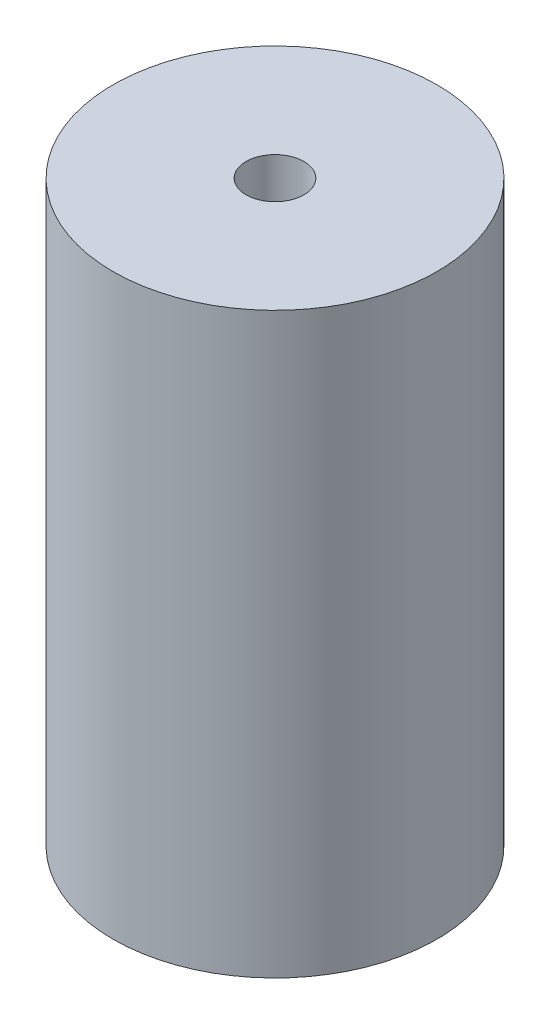
ISO-10303-21;
HEADER;
FILE_DESCRIPTION(('STEP AP214'),'2;1');
FILE_NAME('part.step','',(''),(''),'','','');
FILE_SCHEMA(('AUTOMOTIVE_DESIGN { 1 0 10303 214 1 1 1 1 }'));
ENDSEC;
DATA;
#1=APPLICATION_CONTEXT('core data for automotive mechanical design processes');
#2=APPLICATION_PROTOCOL_DEFINITION('international standard','automotive_design',2000,#1);
#3=PRODUCT_CONTEXT('',#1,'mechanical');
#4=PRODUCT('Part','Part','',(#3));
#5=PRODUCT_RELATED_PRODUCT_CATEGORY('part','',(#4));
#6=PRODUCT_DEFINITION_FORMATION('','',#4);
#7=PRODUCT_DEFINITION_CONTEXT('part definition',#1,'design');
#8=PRODUCT_DEFINITION('design','',#6,#7);
#9=PRODUCT_DEFINITION_SHAPE('','',#8);
#10=(LENGTH_UNIT() NAMED_UNIT(*) SI_UNIT(.MILLI.,.METRE.));
#11=(NAMED_UNIT(*) PLANE_ANGLE_UNIT() SI_UNIT($,.RADIAN.));
#12=(NAMED_UNIT(*) SI_UNIT($,.STERADIAN.) SOLID_ANGLE_UNIT());
#13=UNCERTAINTY_MEASURE_WITH_UNIT(LENGTH_MEASURE(1.E-05),#10,'distance_accuracy_value','');
#14=(GEOMETRIC_REPRESENTATION_CONTEXT(3) GLOBAL_UNCERTAINTY_ASSIGNED_CONTEXT((#13)) GLOBAL_UNIT_ASSIGNED_CONTEXT((#10,
#11,#12)) REPRESENTATION_CONTEXT('',''));
#15=CARTESIAN_POINT('',(0.,0.,0.));
#16=DIRECTION('',(0.,0.,1.));
#17=DIRECTION('',(1.,0.,0.));
#18=AXIS2_PLACEMENT_3D('',#15,#16,#17);
#19=CARTESIAN_POINT('',(0.,50.,0.));
#20=DIRECTION('',(0.,1.,0.));
#21=DIRECTION('',(0.,0.,1.));
#22=AXIS2_PLACEMENT_3D('',#19,#20,#21);
#23=PLANE('',#22);
#24=CARTESIAN_POINT('',(0.,50.,0.));
#25=DIRECTION('',(0.,1.,0.));
#26=DIRECTION('',(0.,0.,1.));
#27=AXIS2_PLACEMENT_3D('',#24,#25,#26);
#28=CIRCLE('',#27,14.);
#29=CARTESIAN_POINT('',(0.,50.,14.));
#30=VERTEX_POINT('',#29);
#31=EDGE_CURVE('E10',#30,#30,#28,.T.);
#32=ORIENTED_EDGE('',*,*,#31,.T.);
#33=EDGE_LOOP('',(#32));
#34=FACE_BOUND('',#33,.T.);
#35=CARTESIAN_POINT('',(0.,50.,0.));
#36=DIRECTION('',(0.,1.,0.));
#37=DIRECTION('',(0.,0.,1.));
#38=AXIS2_PLACEMENT_3D('',#35,#36,#37);
#39=CIRCLE('',#38,2.5);
#40=CARTESIAN_POINT('',(0.,50.,2.5));
#41=VERTEX_POINT('',#40);
#42=EDGE_CURVE('E46',#41,#41,#39,.T.);
#43=ORIENTED_EDGE('',*,*,#42,.F.);
#44=EDGE_LOOP('',(#43));
#45=FACE_BOUND('',#44,.T.);
#46=ADVANCED_FACE('F35',(#34,#45),#23,.T.);
#47=CARTESIAN_POINT('',(0.,0.,0.));
#48=DIRECTION('',(0.,1.,0.));
#49=DIRECTION('',(0.,0.,1.));
#50=AXIS2_PLACEMENT_3D('',#47,#48,#49);
#51=PLANE('',#50);
#52=CARTESIAN_POINT('',(0.,0.,0.));
#53=DIRECTION('',(0.,1.,0.));
#54=DIRECTION('',(0.,0.,1.));
#55=AXIS2_PLACEMENT_3D('',#52,#53,#54);
#56=CIRCLE('',#55,14.);
#57=CARTESIAN_POINT('',(0.,0.,14.));
#58=VERTEX_POINT('',#57);
#59=EDGE_CURVE('E39',#58,#58,#56,.T.);
#60=ORIENTED_EDGE('',*,*,#59,.F.);
#61=EDGE_LOOP('',(#60));
#62=FACE_BOUND('',#61,.T.);
#63=CARTESIAN_POINT('',(0.,0.,0.));
#64=DIRECTION('',(0.,1.,0.));
#65=DIRECTION('',(0.,0.,1.));
#66=AXIS2_PLACEMENT_3D('',#63,#64,#65);
#67=CIRCLE('',#66,2.5);
#68=CARTESIAN_POINT('',(0.,0.,2.5));
#69=VERTEX_POINT('',#68);
#70=EDGE_CURVE('E48',#69,#69,#67,.T.);
#71=ORIENTED_EDGE('',*,*,#70,.T.);
#72=EDGE_LOOP('',(#71));
#73=FACE_BOUND('',#72,.T.);
#74=ADVANCED_FACE('F58',(#62,#73),#51,.F.);
#75=CARTESIAN_POINT('',(0.,50.,0.));
#76=DIRECTION('',(0.,-1.,0.));
#77=DIRECTION('',(0.,0.,-1.));
#78=AXIS2_PLACEMENT_3D('',#75,#76,#77);
#79=CYLINDRICAL_SURFACE('',#78,14.);
#80=ORIENTED_EDGE('',*,*,#31,.F.);
#81=EDGE_LOOP('',(#80));
#82=FACE_BOUND('',#81,.T.);
#83=ORIENTED_EDGE('',*,*,#59,.T.);
#84=EDGE_LOOP('',(#83));
#85=FACE_BOUND('',#84,.T.);
#86=ADVANCED_FACE('F37',(#82,#85),#79,.T.);
#87=CARTESIAN_POINT('',(0.,50.,0.));
#88=DIRECTION('',(0.,-1.,0.));
#89=DIRECTION('',(0.,0.,-1.));
#90=AXIS2_PLACEMENT_3D('',#87,#88,#89);
#91=CYLINDRICAL_SURFACE('',#90,2.5);
#92=ORIENTED_EDGE('',*,*,#42,.T.);
#93=EDGE_LOOP('',(#92));
#94=FACE_BOUND('',#93,.T.);
#95=ORIENTED_EDGE('',*,*,#70,.F.);
#96=EDGE_LOOP('',(#95));
#97=FACE_BOUND('',#96,.T.);
#98=ADVANCED_FACE('F54',(#94,#97),#91,.F.);
#99=CLOSED_SHELL('',(#46,#74,#86,#98));
#100=MANIFOLD_SOLID_BREP('B2',#99);
#101=ADVANCED_BREP_SHAPE_REPRESENTATION('',(#18,#100),#14);
#102=SHAPE_DEFINITION_REPRESENTATION(#9,#101);
ENDSEC;
END-ISO-10303-21;
